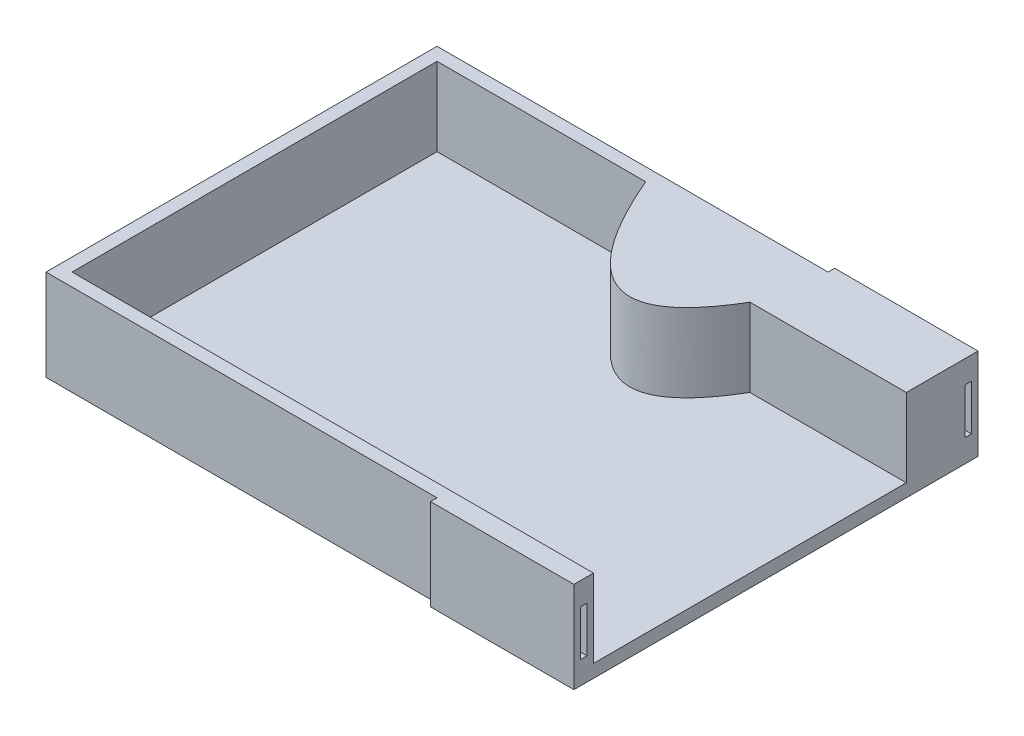
ISO-10303-21;
HEADER;
FILE_DESCRIPTION(('STEP AP214'),'2;1');
FILE_NAME('part.step','',(''),(''),'','','');
FILE_SCHEMA(('AUTOMOTIVE_DESIGN { 1 0 10303 214 1 1 1 1 }'));
ENDSEC;
DATA;
#1=APPLICATION_CONTEXT('core data for automotive mechanical design processes');
#2=APPLICATION_PROTOCOL_DEFINITION('international standard','automotive_design',2000,#1);
#3=PRODUCT_CONTEXT('',#1,'mechanical');
#4=PRODUCT('Part','Part','',(#3));
#5=PRODUCT_RELATED_PRODUCT_CATEGORY('part','',(#4));
#6=PRODUCT_DEFINITION_FORMATION('','',#4);
#7=PRODUCT_DEFINITION_CONTEXT('part definition',#1,'design');
#8=PRODUCT_DEFINITION('design','',#6,#7);
#9=PRODUCT_DEFINITION_SHAPE('','',#8);
#10=(LENGTH_UNIT() NAMED_UNIT(*) SI_UNIT(.MILLI.,.METRE.));
#11=(NAMED_UNIT(*) PLANE_ANGLE_UNIT() SI_UNIT($,.RADIAN.));
#12=(NAMED_UNIT(*) SI_UNIT($,.STERADIAN.) SOLID_ANGLE_UNIT());
#13=UNCERTAINTY_MEASURE_WITH_UNIT(LENGTH_MEASURE(1.E-05),#10,'distance_accuracy_value','');
#14=(GEOMETRIC_REPRESENTATION_CONTEXT(3) GLOBAL_UNCERTAINTY_ASSIGNED_CONTEXT((#13)) GLOBAL_UNIT_ASSIGNED_CONTEXT((#10,
#11,#12)) REPRESENTATION_CONTEXT('',''));
#15=CARTESIAN_POINT('',(0.,0.,0.));
#16=DIRECTION('',(0.,0.,1.));
#17=DIRECTION('',(1.,0.,0.));
#18=AXIS2_PLACEMENT_3D('',#15,#16,#17);
#19=CARTESIAN_POINT('',(0.,0.,75.));
#20=DIRECTION('',(0.,0.,-1.));
#21=DIRECTION('',(-1.,0.,0.));
#22=AXIS2_PLACEMENT_3D('',#19,#20,#21);
#23=PLANE('',#22);
#24=DIRECTION('',(0.,-1.,0.));
#25=VECTOR('',#24,1.);
#26=CARTESIAN_POINT('',(-55.,0.,75.));
#27=LINE('',#26,#25);
#28=CARTESIAN_POINT('',(-55.,35.,75.));
#29=VERTEX_POINT('',#28);
#30=CARTESIAN_POINT('',(-55.,0.,75.));
#31=VERTEX_POINT('',#30);
#32=EDGE_CURVE('E293',#29,#31,#27,.T.);
#33=ORIENTED_EDGE('',*,*,#32,.F.);
#34=DIRECTION('',(-1.,0.,0.));
#35=VECTOR('',#34,1.);
#36=CARTESIAN_POINT('',(-200.,35.,75.));
#37=LINE('',#36,#35);
#38=CARTESIAN_POINT('',(-205.,35.,75.));
#39=VERTEX_POINT('',#38);
#40=EDGE_CURVE('E386',#29,#39,#37,.T.);
#41=ORIENTED_EDGE('',*,*,#40,.T.);
#42=DIRECTION('',(0.,1.,0.));
#43=VECTOR('',#42,1.);
#44=CARTESIAN_POINT('',(-205.,0.,75.));
#45=LINE('',#44,#43);
#46=CARTESIAN_POINT('',(-205.,0.,75.));
#47=VERTEX_POINT('',#46);
#48=EDGE_CURVE('E375',#47,#39,#45,.T.);
#49=ORIENTED_EDGE('',*,*,#48,.F.);
#50=DIRECTION('',(1.,0.,0.));
#51=VECTOR('',#50,1.);
#52=CARTESIAN_POINT('',(-200.,0.,75.));
#53=LINE('',#52,#51);
#54=EDGE_CURVE('E384',#47,#31,#53,.T.);
#55=ORIENTED_EDGE('',*,*,#54,.T.);
#56=EDGE_LOOP('',(#33,#41,#49,#55));
#57=FACE_BOUND('',#56,.T.);
#58=ADVANCED_FACE('F39',(#57),#23,.F.);
#59=CARTESIAN_POINT('',(-120.,35.,-70.));
#60=CARTESIAN_POINT('',(-89.7131671713932,35.,0.733691908096874));
#61=CARTESIAN_POINT('',(-60.,35.,-50.));
#62=B_SPLINE_CURVE_WITH_KNOTS('',2,(#59,#60,#61),.UNSPECIFIED.,.F.,.F.,(3,3),(0.,1.),.UNSPECIFIED.);
#63=DIRECTION('',(0.,-1.,0.));
#64=VECTOR('',#63,1.);
#65=SURFACE_OF_LINEAR_EXTRUSION('',#62,#64);
#66=DIRECTION('',(0.,-1.,0.));
#67=VECTOR('',#66,1.);
#68=CARTESIAN_POINT('',(-120.,35.,-70.));
#69=LINE('',#68,#67);
#70=CARTESIAN_POINT('',(-120.,35.,-70.));
#71=VERTEX_POINT('',#70);
#72=CARTESIAN_POINT('',(-120.,5.,-70.));
#73=VERTEX_POINT('',#72);
#74=EDGE_CURVE('E433',#71,#73,#69,.T.);
#75=ORIENTED_EDGE('',*,*,#74,.T.);
#76=CARTESIAN_POINT('',(-120.,5.,-70.));
#77=CARTESIAN_POINT('',(-89.7131671713932,5.,0.733691908096874));
#78=CARTESIAN_POINT('',(-60.,5.,-50.));
#79=B_SPLINE_CURVE_WITH_KNOTS('',2,(#76,#77,#78),.UNSPECIFIED.,.F.,.F.,(3,3),(0.,1.),.UNSPECIFIED.);
#80=CARTESIAN_POINT('',(-60.,5.,-50.));
#81=VERTEX_POINT('',#80);
#82=EDGE_CURVE('E403',#73,#81,#79,.T.);
#83=ORIENTED_EDGE('',*,*,#82,.T.);
#84=DIRECTION('',(0.,-1.,0.));
#85=VECTOR('',#84,1.);
#86=CARTESIAN_POINT('',(-60.,35.,-50.));
#87=LINE('',#86,#85);
#88=CARTESIAN_POINT('',(-60.,35.,-50.));
#89=VERTEX_POINT('',#88);
#90=EDGE_CURVE('E442',#89,#81,#87,.T.);
#91=ORIENTED_EDGE('',*,*,#90,.F.);
#92=EDGE_CURVE('E418',#71,#89,#62,.T.);
#93=ORIENTED_EDGE('',*,*,#92,.F.);
#94=EDGE_LOOP('',(#75,#83,#91,#93));
#95=FACE_BOUND('',#94,.T.);
#96=ADVANCED_FACE('F41',(#95),#65,.F.);
#97=CARTESIAN_POINT('',(0.,35.,-49.9999999999999));
#98=DIRECTION('',(0.,0.,1.));
#99=DIRECTION('',(1.,0.,0.));
#100=AXIS2_PLACEMENT_3D('',#97,#98,#99);
#101=PLANE('',#100);
#102=DIRECTION('',(-1.,0.,0.));
#103=VECTOR('',#102,1.);
#104=CARTESIAN_POINT('',(0.,5.,-49.9999999999999));
#105=LINE('',#104,#103);
#106=CARTESIAN_POINT('',(0.,5.,-49.9999999999999));
#107=VERTEX_POINT('',#106);
#108=EDGE_CURVE('E417',#107,#81,#105,.T.);
#109=ORIENTED_EDGE('',*,*,#108,.F.);
#110=DIRECTION('',(0.,-1.,0.));
#111=VECTOR('',#110,1.);
#112=CARTESIAN_POINT('',(0.,35.,-49.9999999999999));
#113=LINE('',#112,#111);
#114=CARTESIAN_POINT('',(0.,35.,-49.9999999999999));
#115=VERTEX_POINT('',#114);
#116=EDGE_CURVE('E437',#115,#107,#113,.T.);
#117=ORIENTED_EDGE('',*,*,#116,.F.);
#118=DIRECTION('',(-1.,0.,0.));
#119=VECTOR('',#118,1.);
#120=CARTESIAN_POINT('',(0.,35.,-49.9999999999999));
#121=LINE('',#120,#119);
#122=EDGE_CURVE('E423',#115,#89,#121,.T.);
#123=ORIENTED_EDGE('',*,*,#122,.T.);
#124=ORIENTED_EDGE('',*,*,#90,.T.);
#125=EDGE_LOOP('',(#109,#117,#123,#124));
#126=FACE_BOUND('',#125,.T.);
#127=ADVANCED_FACE('F500',(#126),#101,.T.);
#128=CARTESIAN_POINT('',(0.,35.,0.));
#129=DIRECTION('',(1.,0.,0.));
#130=DIRECTION('',(0.,0.,-1.));
#131=AXIS2_PLACEMENT_3D('',#128,#129,#130);
#132=PLANE('',#131);
#133=DIRECTION('',(0.,0.,1.));
#134=VECTOR('',#133,1.);
#135=CARTESIAN_POINT('',(0.,0.,0.));
#136=LINE('',#135,#134);
#137=CARTESIAN_POINT('',(0.,0.,-77.5));
#138=VERTEX_POINT('',#137);
#139=CARTESIAN_POINT('',(0.,0.,77.5));
#140=VERTEX_POINT('',#139);
#141=EDGE_CURVE('E424',#138,#140,#136,.T.);
#142=ORIENTED_EDGE('',*,*,#141,.F.);
#143=DIRECTION('',(0.,-1.,0.));
#144=VECTOR('',#143,1.);
#145=CARTESIAN_POINT('',(0.,0.,-77.5));
#146=LINE('',#145,#144);
#147=CARTESIAN_POINT('',(0.,35.,-77.5));
#148=VERTEX_POINT('',#147);
#149=EDGE_CURVE('E269',#148,#138,#146,.T.);
#150=ORIENTED_EDGE('',*,*,#149,.F.);
#151=DIRECTION('',(0.,0.,1.));
#152=VECTOR('',#151,1.);
#153=CARTESIAN_POINT('',(0.,35.,0.));
#154=LINE('',#153,#152);
#155=EDGE_CURVE('E430',#148,#115,#154,.T.);
#156=ORIENTED_EDGE('',*,*,#155,.T.);
#157=ORIENTED_EDGE('',*,*,#116,.T.);
#158=DIRECTION('',(0.,0.,1.));
#159=VECTOR('',#158,1.);
#160=CARTESIAN_POINT('',(0.,5.,0.));
#161=LINE('',#160,#159);
#162=CARTESIAN_POINT('',(0.,5.,70.));
#163=VERTEX_POINT('',#162);
#164=EDGE_CURVE('E415',#107,#163,#161,.T.);
#165=ORIENTED_EDGE('',*,*,#164,.T.);
#166=DIRECTION('',(0.,1.,0.));
#167=VECTOR('',#166,1.);
#168=CARTESIAN_POINT('',(0.,0.,70.));
#169=LINE('',#168,#167);
#170=CARTESIAN_POINT('',(0.,35.,70.));
#171=VERTEX_POINT('',#170);
#172=EDGE_CURVE('E392',#163,#171,#169,.T.);
#173=ORIENTED_EDGE('',*,*,#172,.T.);
#174=DIRECTION('',(0.,0.,-1.));
#175=VECTOR('',#174,1.);
#176=CARTESIAN_POINT('',(0.,35.,75.));
#177=LINE('',#176,#175);
#178=CARTESIAN_POINT('',(0.,35.,77.5));
#179=VERTEX_POINT('',#178);
#180=EDGE_CURVE('E389',#179,#171,#177,.T.);
#181=ORIENTED_EDGE('',*,*,#180,.F.);
#182=DIRECTION('',(0.,1.,0.));
#183=VECTOR('',#182,1.);
#184=CARTESIAN_POINT('',(0.,0.,77.5));
#185=LINE('',#184,#183);
#186=EDGE_CURVE('E289',#140,#179,#185,.T.);
#187=ORIENTED_EDGE('',*,*,#186,.F.);
#188=EDGE_LOOP('',(#142,#150,#156,#157,#165,#173,#181,#187));
#189=FACE_BOUND('',#188,.T.);
#190=DIRECTION('',(0.,0.,1.));
#191=VECTOR('',#190,1.);
#192=CARTESIAN_POINT('',(0.,8.75,72.5));
#193=LINE('',#192,#191);
#194=CARTESIAN_POINT('',(0.,8.75,72.5));
#195=VERTEX_POINT('',#194);
#196=CARTESIAN_POINT('',(0.,8.75,75.));
#197=VERTEX_POINT('',#196);
#198=EDGE_CURVE('E360',#195,#197,#193,.T.);
#199=ORIENTED_EDGE('',*,*,#198,.T.);
#200=DIRECTION('',(0.,1.,0.));
#201=VECTOR('',#200,1.);
#202=CARTESIAN_POINT('',(0.,0.,75.));
#203=LINE('',#202,#201);
#204=CARTESIAN_POINT('',(0.,26.25,75.));
#205=VERTEX_POINT('',#204);
#206=EDGE_CURVE('E288',#197,#205,#203,.T.);
#207=ORIENTED_EDGE('',*,*,#206,.T.);
#208=DIRECTION('',(0.,0.,1.));
#209=VECTOR('',#208,1.);
#210=CARTESIAN_POINT('',(0.,26.25,72.5));
#211=LINE('',#210,#209);
#212=CARTESIAN_POINT('',(0.,26.25,72.5));
#213=VERTEX_POINT('',#212);
#214=EDGE_CURVE('E353',#213,#205,#211,.T.);
#215=ORIENTED_EDGE('',*,*,#214,.F.);
#216=DIRECTION('',(0.,1.,0.));
#217=VECTOR('',#216,1.);
#218=CARTESIAN_POINT('',(0.,26.25,72.5));
#219=LINE('',#218,#217);
#220=EDGE_CURVE('E340',#195,#213,#219,.T.);
#221=ORIENTED_EDGE('',*,*,#220,.F.);
#222=EDGE_LOOP('',(#199,#207,#215,#221));
#223=FACE_BOUND('',#222,.T.);
#224=DIRECTION('',(0.,0.,-1.));
#225=VECTOR('',#224,1.);
#226=CARTESIAN_POINT('',(0.,26.25,-72.5));
#227=LINE('',#226,#225);
#228=CARTESIAN_POINT('',(0.,26.25,-72.5));
#229=VERTEX_POINT('',#228);
#230=CARTESIAN_POINT('',(0.,26.25,-75.));
#231=VERTEX_POINT('',#230);
#232=EDGE_CURVE('E331',#229,#231,#227,.T.);
#233=ORIENTED_EDGE('',*,*,#232,.T.);
#234=DIRECTION('',(0.,-1.,0.));
#235=VECTOR('',#234,1.);
#236=CARTESIAN_POINT('',(0.,0.,-75.));
#237=LINE('',#236,#235);
#238=CARTESIAN_POINT('',(0.,8.75,-75.));
#239=VERTEX_POINT('',#238);
#240=EDGE_CURVE('E263',#231,#239,#237,.T.);
#241=ORIENTED_EDGE('',*,*,#240,.T.);
#242=DIRECTION('',(0.,0.,-1.));
#243=VECTOR('',#242,1.);
#244=CARTESIAN_POINT('',(0.,8.75,-72.5));
#245=LINE('',#244,#243);
#246=CARTESIAN_POINT('',(0.,8.75,-72.5));
#247=VERTEX_POINT('',#246);
#248=EDGE_CURVE('E324',#247,#239,#245,.T.);
#249=ORIENTED_EDGE('',*,*,#248,.F.);
#250=DIRECTION('',(0.,-1.,0.));
#251=VECTOR('',#250,1.);
#252=CARTESIAN_POINT('',(0.,26.25,-72.5));
#253=LINE('',#252,#251);
#254=EDGE_CURVE('E311',#229,#247,#253,.T.);
#255=ORIENTED_EDGE('',*,*,#254,.F.);
#256=EDGE_LOOP('',(#233,#241,#249,#255));
#257=FACE_BOUND('',#256,.T.);
#258=ADVANCED_FACE('F525',(#189,#223,#257),#132,.T.);
#259=CARTESIAN_POINT('',(0.,35.,0.));
#260=DIRECTION('',(0.,1.,0.));
#261=DIRECTION('',(0.,0.,1.));
#262=AXIS2_PLACEMENT_3D('',#259,#260,#261);
#263=PLANE('',#262);
#264=ORIENTED_EDGE('',*,*,#92,.T.);
#265=ORIENTED_EDGE('',*,*,#122,.F.);
#266=ORIENTED_EDGE('',*,*,#155,.F.);
#267=DIRECTION('',(1.,0.,0.));
#268=VECTOR('',#267,1.);
#269=CARTESIAN_POINT('',(0.,35.,-77.5));
#270=LINE('',#269,#268);
#271=CARTESIAN_POINT('',(-55.0000000000001,35.,-77.5));
#272=VERTEX_POINT('',#271);
#273=EDGE_CURVE('E276',#272,#148,#270,.T.);
#274=ORIENTED_EDGE('',*,*,#273,.F.);
#275=DIRECTION('',(0.,0.,1.));
#276=VECTOR('',#275,1.);
#277=CARTESIAN_POINT('',(-55.0000000000001,35.,-77.5));
#278=LINE('',#277,#276);
#279=CARTESIAN_POINT('',(-55.0000000000001,35.,-75.));
#280=VERTEX_POINT('',#279);
#281=EDGE_CURVE('E279',#272,#280,#278,.T.);
#282=ORIENTED_EDGE('',*,*,#281,.T.);
#283=DIRECTION('',(1.,0.,0.));
#284=VECTOR('',#283,1.);
#285=CARTESIAN_POINT('',(-200.,35.,-75.));
#286=LINE('',#285,#284);
#287=CARTESIAN_POINT('',(-205.,35.,-75.));
#288=VERTEX_POINT('',#287);
#289=EDGE_CURVE('E398',#288,#280,#286,.T.);
#290=ORIENTED_EDGE('',*,*,#289,.F.);
#291=DIRECTION('',(0.,0.,-1.));
#292=VECTOR('',#291,1.);
#293=CARTESIAN_POINT('',(-205.,35.,-75.));
#294=LINE('',#293,#292);
#295=EDGE_CURVE('E378',#39,#288,#294,.T.);
#296=ORIENTED_EDGE('',*,*,#295,.F.);
#297=ORIENTED_EDGE('',*,*,#40,.F.);
#298=DIRECTION('',(0.,0.,-1.));
#299=VECTOR('',#298,1.);
#300=CARTESIAN_POINT('',(-55.,35.,77.5));
#301=LINE('',#300,#299);
#302=CARTESIAN_POINT('',(-55.,35.,77.5));
#303=VERTEX_POINT('',#302);
#304=EDGE_CURVE('E307',#303,#29,#301,.T.);
#305=ORIENTED_EDGE('',*,*,#304,.F.);
#306=DIRECTION('',(-1.,0.,0.));
#307=VECTOR('',#306,1.);
#308=CARTESIAN_POINT('',(0.,35.,77.5));
#309=LINE('',#308,#307);
#310=EDGE_CURVE('E292',#179,#303,#309,.T.);
#311=ORIENTED_EDGE('',*,*,#310,.F.);
#312=ORIENTED_EDGE('',*,*,#180,.T.);
#313=DIRECTION('',(-1.,0.,0.));
#314=VECTOR('',#313,1.);
#315=CARTESIAN_POINT('',(-200.,35.,70.));
#316=LINE('',#315,#314);
#317=CARTESIAN_POINT('',(-200.,35.,70.));
#318=VERTEX_POINT('',#317);
#319=EDGE_CURVE('E387',#171,#318,#316,.T.);
#320=ORIENTED_EDGE('',*,*,#319,.T.);
#321=DIRECTION('',(0.,0.,-1.));
#322=VECTOR('',#321,1.);
#323=CARTESIAN_POINT('',(-200.,35.,-75.));
#324=LINE('',#323,#322);
#325=CARTESIAN_POINT('',(-200.,35.,-70.));
#326=VERTEX_POINT('',#325);
#327=EDGE_CURVE('E363',#318,#326,#324,.T.);
#328=ORIENTED_EDGE('',*,*,#327,.T.);
#329=DIRECTION('',(1.,0.,0.));
#330=VECTOR('',#329,1.);
#331=CARTESIAN_POINT('',(-200.,35.,-70.));
#332=LINE('',#331,#330);
#333=EDGE_CURVE('E401',#326,#71,#332,.T.);
#334=ORIENTED_EDGE('',*,*,#333,.T.);
#335=EDGE_LOOP('',(#264,#265,#266,#274,#282,#290,#296,#297,#305,#311,#312,#320,#328,#334));
#336=FACE_BOUND('',#335,.T.);
#337=ADVANCED_FACE('F522',(#336),#263,.T.);
#338=CARTESIAN_POINT('',(0.,0.,0.));
#339=DIRECTION('',(0.,1.,0.));
#340=DIRECTION('',(0.,0.,1.));
#341=AXIS2_PLACEMENT_3D('',#338,#339,#340);
#342=PLANE('',#341);
#343=DIRECTION('',(-1.,0.,0.));
#344=VECTOR('',#343,1.);
#345=CARTESIAN_POINT('',(0.,0.,-70.));
#346=LINE('',#345,#344);
#347=CARTESIAN_POINT('',(-5.00000000000006,0.,-70.));
#348=VERTEX_POINT('',#347);
#349=CARTESIAN_POINT('',(-114.377865486868,0.,-70.));
#350=VERTEX_POINT('',#349);
#351=EDGE_CURVE('E48',#348,#350,#346,.T.);
#352=ORIENTED_EDGE('',*,*,#351,.T.);
#353=DIRECTION('',(0.457242734720878,0.,0.889341937358727));
#354=VECTOR('',#353,1.);
#355=CARTESIAN_POINT('',(-61.9996203308124,0.,31.8762387793279));
#356=LINE('',#355,#354);
#357=CARTESIAN_POINT('',(-103.799594749147,0.,-49.4251519435657));
#358=VERTEX_POINT('',#357);
#359=EDGE_CURVE('E11',#350,#358,#356,.T.);
#360=ORIENTED_EDGE('',*,*,#359,.T.);
#361=CARTESIAN_POINT('',(-103.799594749147,0.,-49.4251519435657));
#362=CARTESIAN_POINT('',(-99.2051605131029,0.,-42.585467380585));
#363=CARTESIAN_POINT('',(-92.286089612762,0.,-36.3651585992353));
#364=CARTESIAN_POINT('',(-88.081814147023,0.,-34.294431753635));
#365=CARTESIAN_POINT('',(-85.4337162972055,0.,-33.7920961129075));
#366=CARTESIAN_POINT('',(-83.3961782752048,0.,-33.8237575613017));
#367=CARTESIAN_POINT('',(-81.3048633703737,0.,-34.2924033606753));
#368=CARTESIAN_POINT('',(-78.5001043520789,0.,-35.5110922493851));
#369=CARTESIAN_POINT('',(-74.1123007701366,0.,-38.8128478568057));
#370=CARTESIAN_POINT('',(-69.3283756488378,0.,-44.5174770783803));
#371=CARTESIAN_POINT('',(-66.3438674231853,0.,-49.0844572629766));
#372=CARTESIAN_POINT('',(-65.1040192502342,0.,-51.155937562833));
#373=CARTESIAN_POINT('',(-64.4011869805069,0.,-52.3723279960872));
#374=CARTESIAN_POINT('',(-63.466265427309,0.,-54.0216022142181));
#375=CARTESIAN_POINT('',(-62.9095659229218,0.,-54.9999999999999));
#376=B_SPLINE_CURVE_WITH_KNOTS('',2,(#361,#362,#363,#364,#365,#366,#367,#368,#369,#370,#371,
#372,#373,#374,#375),.UNSPECIFIED.,.F.,.F.,(3,1,1,1,1,1,1,1,1,1,1,1,1,3),(-0.0310241649131791,
0.161695719545825,0.290175642518495,0.386535584747997,0.450775546234332,0.515015507720667,
0.579255469207002,0.675615411436504,0.804095334409174,0.900455276638676,0.940605252567635,
0.956665242939219,0.972725233310803,0.996815218868178),.UNSPECIFIED.);
#377=CARTESIAN_POINT('',(-62.9095659229218,0.,-54.9999999999999));
#378=VERTEX_POINT('',#377);
#379=EDGE_CURVE('E222',#358,#378,#376,.T.);
#380=ORIENTED_EDGE('',*,*,#379,.T.);
#381=DIRECTION('',(1.,0.,0.));
#382=VECTOR('',#381,1.);
#383=CARTESIAN_POINT('',(-3.03152014647316E-13,0.,-54.9999999999999));
#384=LINE('',#383,#382);
#385=CARTESIAN_POINT('',(-5.00000000000006,0.,-54.9999999999999));
#386=VERTEX_POINT('',#385);
#387=EDGE_CURVE('E464',#378,#386,#384,.T.);
#388=ORIENTED_EDGE('',*,*,#387,.T.);
#389=DIRECTION('',(0.,0.,-1.));
#390=VECTOR('',#389,1.);
#391=CARTESIAN_POINT('',(-5.00000000000006,0.,0.));
#392=LINE('',#391,#390);
#393=EDGE_CURVE('E470',#386,#348,#392,.T.);
#394=ORIENTED_EDGE('',*,*,#393,.T.);
#395=EDGE_LOOP('',(#352,#360,#380,#388,#394));
#396=FACE_BOUND('',#395,.T.);
#397=ORIENTED_EDGE('',*,*,#54,.F.);
#398=DIRECTION('',(0.,0.,1.));
#399=VECTOR('',#398,1.);
#400=CARTESIAN_POINT('',(-205.,0.,-75.));
#401=LINE('',#400,#399);
#402=CARTESIAN_POINT('',(-205.,0.,-75.));
#403=VERTEX_POINT('',#402);
#404=EDGE_CURVE('E372',#403,#47,#401,.T.);
#405=ORIENTED_EDGE('',*,*,#404,.F.);
#406=DIRECTION('',(-1.,0.,0.));
#407=VECTOR('',#406,1.);
#408=CARTESIAN_POINT('',(-200.,0.,-75.));
#409=LINE('',#408,#407);
#410=CARTESIAN_POINT('',(-55.,0.,-75.));
#411=VERTEX_POINT('',#410);
#412=EDGE_CURVE('E400',#411,#403,#409,.T.);
#413=ORIENTED_EDGE('',*,*,#412,.F.);
#414=DIRECTION('',(0.,0.,1.));
#415=VECTOR('',#414,1.);
#416=CARTESIAN_POINT('',(-55.0000000000001,0.,-77.5));
#417=LINE('',#416,#415);
#418=CARTESIAN_POINT('',(-55.0000000000001,0.,-77.5));
#419=VERTEX_POINT('',#418);
#420=EDGE_CURVE('E285',#419,#411,#417,.T.);
#421=ORIENTED_EDGE('',*,*,#420,.F.);
#422=DIRECTION('',(-1.,0.,0.));
#423=VECTOR('',#422,1.);
#424=CARTESIAN_POINT('',(0.,0.,-77.5));
#425=LINE('',#424,#423);
#426=EDGE_CURVE('E272',#138,#419,#425,.T.);
#427=ORIENTED_EDGE('',*,*,#426,.F.);
#428=ORIENTED_EDGE('',*,*,#141,.T.);
#429=DIRECTION('',(1.,0.,0.));
#430=VECTOR('',#429,1.);
#431=CARTESIAN_POINT('',(0.,0.,77.5));
#432=LINE('',#431,#430);
#433=CARTESIAN_POINT('',(-55.,0.,77.5));
#434=VERTEX_POINT('',#433);
#435=EDGE_CURVE('E297',#434,#140,#432,.T.);
#436=ORIENTED_EDGE('',*,*,#435,.F.);
#437=DIRECTION('',(0.,0.,-1.));
#438=VECTOR('',#437,1.);
#439=CARTESIAN_POINT('',(-55.,0.,77.5));
#440=LINE('',#439,#438);
#441=EDGE_CURVE('E300',#434,#31,#440,.T.);
#442=ORIENTED_EDGE('',*,*,#441,.T.);
#443=EDGE_LOOP('',(#397,#405,#413,#421,#427,#428,#436,#442));
#444=FACE_BOUND('',#443,.T.);
#445=ADVANCED_FACE('F474',(#396,#444),#342,.F.);
#446=CARTESIAN_POINT('',(0.,5.,0.));
#447=DIRECTION('',(0.,1.,0.));
#448=DIRECTION('',(0.,0.,1.));
#449=AXIS2_PLACEMENT_3D('',#446,#447,#448);
#450=PLANE('',#449);
#451=ORIENTED_EDGE('',*,*,#82,.F.);
#452=DIRECTION('',(1.,0.,0.));
#453=VECTOR('',#452,1.);
#454=CARTESIAN_POINT('',(0.,5.,-70.));
#455=LINE('',#454,#453);
#456=CARTESIAN_POINT('',(-200.,5.,-70.));
#457=VERTEX_POINT('',#456);
#458=EDGE_CURVE('E412',#457,#73,#455,.T.);
#459=ORIENTED_EDGE('',*,*,#458,.F.);
#460=DIRECTION('',(0.,0.,1.));
#461=VECTOR('',#460,1.);
#462=CARTESIAN_POINT('',(-200.,5.,0.));
#463=LINE('',#462,#461);
#464=CARTESIAN_POINT('',(-200.,5.,70.));
#465=VERTEX_POINT('',#464);
#466=EDGE_CURVE('E408',#457,#465,#463,.T.);
#467=ORIENTED_EDGE('',*,*,#466,.T.);
#468=DIRECTION('',(1.,0.,0.));
#469=VECTOR('',#468,1.);
#470=CARTESIAN_POINT('',(0.,5.,70.));
#471=LINE('',#470,#469);
#472=EDGE_CURVE('E411',#465,#163,#471,.T.);
#473=ORIENTED_EDGE('',*,*,#472,.T.);
#474=ORIENTED_EDGE('',*,*,#164,.F.);
#475=ORIENTED_EDGE('',*,*,#108,.T.);
#476=EDGE_LOOP('',(#451,#459,#467,#473,#474,#475));
#477=FACE_BOUND('',#476,.T.);
#478=ADVANCED_FACE('F517',(#477),#450,.T.);
#479=CARTESIAN_POINT('',(0.,0.,-70.));
#480=DIRECTION('',(0.,0.,-1.));
#481=DIRECTION('',(-1.,0.,0.));
#482=AXIS2_PLACEMENT_3D('',#479,#480,#481);
#483=PLANE('',#482);
#484=ORIENTED_EDGE('',*,*,#458,.T.);
#485=ORIENTED_EDGE('',*,*,#74,.F.);
#486=ORIENTED_EDGE('',*,*,#333,.F.);
#487=DIRECTION('',(0.,1.,0.));
#488=VECTOR('',#487,1.);
#489=CARTESIAN_POINT('',(-200.,0.,-70.));
#490=LINE('',#489,#488);
#491=EDGE_CURVE('E397',#457,#326,#490,.T.);
#492=ORIENTED_EDGE('',*,*,#491,.F.);
#493=EDGE_LOOP('',(#484,#485,#486,#492));
#494=FACE_BOUND('',#493,.T.);
#495=ADVANCED_FACE('F514',(#494),#483,.F.);
#496=CARTESIAN_POINT('',(0.,0.,-75.));
#497=DIRECTION('',(0.,0.,-1.));
#498=DIRECTION('',(-1.,0.,0.));
#499=AXIS2_PLACEMENT_3D('',#496,#497,#498);
#500=PLANE('',#499);
#501=DIRECTION('',(0.,1.,0.));
#502=VECTOR('',#501,1.);
#503=CARTESIAN_POINT('',(-55.0000000000001,0.,-75.));
#504=LINE('',#503,#502);
#505=EDGE_CURVE('E63',#411,#280,#504,.T.);
#506=ORIENTED_EDGE('',*,*,#505,.F.);
#507=ORIENTED_EDGE('',*,*,#412,.T.);
#508=DIRECTION('',(0.,-1.,0.));
#509=VECTOR('',#508,1.);
#510=CARTESIAN_POINT('',(-205.,0.,-75.));
#511=LINE('',#510,#509);
#512=EDGE_CURVE('E369',#288,#403,#511,.T.);
#513=ORIENTED_EDGE('',*,*,#512,.F.);
#514=ORIENTED_EDGE('',*,*,#289,.T.);
#515=EDGE_LOOP('',(#506,#507,#513,#514));
#516=FACE_BOUND('',#515,.T.);
#517=ADVANCED_FACE('F510',(#516),#500,.T.);
#518=CARTESIAN_POINT('',(0.,0.,70.));
#519=DIRECTION('',(0.,0.,-1.));
#520=DIRECTION('',(-1.,0.,0.));
#521=AXIS2_PLACEMENT_3D('',#518,#519,#520);
#522=PLANE('',#521);
#523=ORIENTED_EDGE('',*,*,#472,.F.);
#524=DIRECTION('',(0.,-1.,0.));
#525=VECTOR('',#524,1.);
#526=CARTESIAN_POINT('',(-200.,0.,70.));
#527=LINE('',#526,#525);
#528=EDGE_CURVE('E381',#318,#465,#527,.T.);
#529=ORIENTED_EDGE('',*,*,#528,.F.);
#530=ORIENTED_EDGE('',*,*,#319,.F.);
#531=ORIENTED_EDGE('',*,*,#172,.F.);
#532=EDGE_LOOP('',(#523,#529,#530,#531));
#533=FACE_BOUND('',#532,.T.);
#534=ADVANCED_FACE('F506',(#533),#522,.T.);
#535=CARTESIAN_POINT('',(-205.,0.,0.));
#536=DIRECTION('',(1.,0.,0.));
#537=DIRECTION('',(0.,0.,-1.));
#538=AXIS2_PLACEMENT_3D('',#535,#536,#537);
#539=PLANE('',#538);
#540=ORIENTED_EDGE('',*,*,#512,.T.);
#541=ORIENTED_EDGE('',*,*,#404,.T.);
#542=ORIENTED_EDGE('',*,*,#48,.T.);
#543=ORIENTED_EDGE('',*,*,#295,.T.);
#544=EDGE_LOOP('',(#540,#541,#542,#543));
#545=FACE_BOUND('',#544,.T.);
#546=ADVANCED_FACE('F509',(#545),#539,.F.);
#547=CARTESIAN_POINT('',(-200.,0.,0.));
#548=DIRECTION('',(1.,0.,0.));
#549=DIRECTION('',(0.,0.,-1.));
#550=AXIS2_PLACEMENT_3D('',#547,#548,#549);
#551=PLANE('',#550);
#552=ORIENTED_EDGE('',*,*,#327,.F.);
#553=ORIENTED_EDGE('',*,*,#528,.T.);
#554=ORIENTED_EDGE('',*,*,#466,.F.);
#555=ORIENTED_EDGE('',*,*,#491,.T.);
#556=EDGE_LOOP('',(#552,#553,#554,#555));
#557=FACE_BOUND('',#556,.T.);
#558=ADVANCED_FACE('F504',(#557),#551,.T.);
#559=CARTESIAN_POINT('',(0.,8.75,72.5));
#560=DIRECTION('',(0.,-1.,0.));
#561=DIRECTION('',(1.,0.,0.));
#562=AXIS2_PLACEMENT_3D('',#559,#560,#561);
#563=PLANE('',#562);
#564=DIRECTION('',(1.,0.,0.));
#565=VECTOR('',#564,1.);
#566=CARTESIAN_POINT('',(0.,8.75,75.));
#567=LINE('',#566,#565);
#568=CARTESIAN_POINT('',(-50.,8.74999999999999,75.));
#569=VERTEX_POINT('',#568);
#570=EDGE_CURVE('E344',#569,#197,#567,.T.);
#571=ORIENTED_EDGE('',*,*,#570,.T.);
#572=ORIENTED_EDGE('',*,*,#198,.F.);
#573=DIRECTION('',(1.,0.,0.));
#574=VECTOR('',#573,1.);
#575=CARTESIAN_POINT('',(0.,8.75,72.5));
#576=LINE('',#575,#574);
#577=CARTESIAN_POINT('',(-50.,8.74999999999999,72.5));
#578=VERTEX_POINT('',#577);
#579=EDGE_CURVE('E350',#578,#195,#576,.T.);
#580=ORIENTED_EDGE('',*,*,#579,.F.);
#581=DIRECTION('',(0.,0.,1.));
#582=VECTOR('',#581,1.);
#583=CARTESIAN_POINT('',(-50.,8.74999999999999,72.5));
#584=LINE('',#583,#582);
#585=EDGE_CURVE('E364',#578,#569,#584,.T.);
#586=ORIENTED_EDGE('',*,*,#585,.T.);
#587=EDGE_LOOP('',(#571,#572,#580,#586));
#588=FACE_BOUND('',#587,.T.);
#589=ADVANCED_FACE('F575',(#588),#563,.F.);
#590=CARTESIAN_POINT('',(-50.,26.25,72.5));
#591=DIRECTION('',(-1.,0.,0.));
#592=DIRECTION('',(0.,0.,1.));
#593=AXIS2_PLACEMENT_3D('',#590,#591,#592);
#594=PLANE('',#593);
#595=DIRECTION('',(0.,-1.,0.));
#596=VECTOR('',#595,1.);
#597=CARTESIAN_POINT('',(-50.,26.25,75.));
#598=LINE('',#597,#596);
#599=CARTESIAN_POINT('',(-50.,26.25,75.));
#600=VERTEX_POINT('',#599);
#601=EDGE_CURVE('E356',#600,#569,#598,.T.);
#602=ORIENTED_EDGE('',*,*,#601,.T.);
#603=ORIENTED_EDGE('',*,*,#585,.F.);
#604=DIRECTION('',(0.,-1.,0.));
#605=VECTOR('',#604,1.);
#606=CARTESIAN_POINT('',(-50.,26.25,72.5));
#607=LINE('',#606,#605);
#608=CARTESIAN_POINT('',(-50.,26.25,72.5));
#609=VERTEX_POINT('',#608);
#610=EDGE_CURVE('E347',#609,#578,#607,.T.);
#611=ORIENTED_EDGE('',*,*,#610,.F.);
#612=DIRECTION('',(0.,0.,1.));
#613=VECTOR('',#612,1.);
#614=CARTESIAN_POINT('',(-50.,26.25,72.5));
#615=LINE('',#614,#613);
#616=EDGE_CURVE('E366',#609,#600,#615,.T.);
#617=ORIENTED_EDGE('',*,*,#616,.T.);
#618=EDGE_LOOP('',(#602,#603,#611,#617));
#619=FACE_BOUND('',#618,.T.);
#620=ADVANCED_FACE('F581',(#619),#594,.F.);
#621=CARTESIAN_POINT('',(0.,26.25,72.5));
#622=DIRECTION('',(0.,1.,0.));
#623=DIRECTION('',(-1.,0.,0.));
#624=AXIS2_PLACEMENT_3D('',#621,#622,#623);
#625=PLANE('',#624);
#626=DIRECTION('',(-1.,0.,0.));
#627=VECTOR('',#626,1.);
#628=CARTESIAN_POINT('',(0.,26.25,75.));
#629=LINE('',#628,#627);
#630=EDGE_CURVE('E334',#205,#600,#629,.T.);
#631=ORIENTED_EDGE('',*,*,#630,.T.);
#632=ORIENTED_EDGE('',*,*,#616,.F.);
#633=DIRECTION('',(-1.,0.,0.));
#634=VECTOR('',#633,1.);
#635=CARTESIAN_POINT('',(0.,26.25,72.5));
#636=LINE('',#635,#634);
#637=EDGE_CURVE('E343',#213,#609,#636,.T.);
#638=ORIENTED_EDGE('',*,*,#637,.F.);
#639=ORIENTED_EDGE('',*,*,#214,.T.);
#640=EDGE_LOOP('',(#631,#632,#638,#639));
#641=FACE_BOUND('',#640,.T.);
#642=ADVANCED_FACE('F587',(#641),#625,.F.);
#643=CARTESIAN_POINT('',(0.,0.,72.5));
#644=DIRECTION('',(0.,0.,-1.));
#645=DIRECTION('',(-1.,0.,0.));
#646=AXIS2_PLACEMENT_3D('',#643,#644,#645);
#647=PLANE('',#646);
#648=ORIENTED_EDGE('',*,*,#220,.T.);
#649=ORIENTED_EDGE('',*,*,#637,.T.);
#650=ORIENTED_EDGE('',*,*,#610,.T.);
#651=ORIENTED_EDGE('',*,*,#579,.T.);
#652=EDGE_LOOP('',(#648,#649,#650,#651));
#653=FACE_BOUND('',#652,.T.);
#654=ADVANCED_FACE('F590',(#653),#647,.F.);
#655=CARTESIAN_POINT('',(0.,26.25,-72.5));
#656=DIRECTION('',(0.,1.,0.));
#657=DIRECTION('',(0.,0.,1.));
#658=AXIS2_PLACEMENT_3D('',#655,#656,#657);
#659=PLANE('',#658);
#660=DIRECTION('',(1.,0.,0.));
#661=VECTOR('',#660,1.);
#662=CARTESIAN_POINT('',(0.,26.25,-75.));
#663=LINE('',#662,#661);
#664=CARTESIAN_POINT('',(-50.,26.25,-75.));
#665=VERTEX_POINT('',#664);
#666=EDGE_CURVE('E315',#665,#231,#663,.T.);
#667=ORIENTED_EDGE('',*,*,#666,.T.);
#668=ORIENTED_EDGE('',*,*,#232,.F.);
#669=DIRECTION('',(1.,0.,0.));
#670=VECTOR('',#669,1.);
#671=CARTESIAN_POINT('',(0.,26.25,-72.5));
#672=LINE('',#671,#670);
#673=CARTESIAN_POINT('',(-50.,26.25,-72.5));
#674=VERTEX_POINT('',#673);
#675=EDGE_CURVE('E321',#674,#229,#672,.T.);
#676=ORIENTED_EDGE('',*,*,#675,.F.);
#677=DIRECTION('',(0.,0.,-1.));
#678=VECTOR('',#677,1.);
#679=CARTESIAN_POINT('',(-50.,26.25,-72.5));
#680=LINE('',#679,#678);
#681=EDGE_CURVE('E335',#674,#665,#680,.T.);
#682=ORIENTED_EDGE('',*,*,#681,.T.);
#683=EDGE_LOOP('',(#667,#668,#676,#682));
#684=FACE_BOUND('',#683,.T.);
#685=ADVANCED_FACE('F597',(#684),#659,.F.);
#686=CARTESIAN_POINT('',(-50.,26.25,-72.5));
#687=DIRECTION('',(-1.,0.,0.));
#688=DIRECTION('',(0.,0.,1.));
#689=AXIS2_PLACEMENT_3D('',#686,#687,#688);
#690=PLANE('',#689);
#691=DIRECTION('',(0.,1.,0.));
#692=VECTOR('',#691,1.);
#693=CARTESIAN_POINT('',(-50.,26.25,-75.));
#694=LINE('',#693,#692);
#695=CARTESIAN_POINT('',(-50.,8.75,-75.));
#696=VERTEX_POINT('',#695);
#697=EDGE_CURVE('E327',#696,#665,#694,.T.);
#698=ORIENTED_EDGE('',*,*,#697,.T.);
#699=ORIENTED_EDGE('',*,*,#681,.F.);
#700=DIRECTION('',(0.,1.,0.));
#701=VECTOR('',#700,1.);
#702=CARTESIAN_POINT('',(-50.,26.25,-72.5));
#703=LINE('',#702,#701);
#704=CARTESIAN_POINT('',(-50.,8.75,-72.5));
#705=VERTEX_POINT('',#704);
#706=EDGE_CURVE('E318',#705,#674,#703,.T.);
#707=ORIENTED_EDGE('',*,*,#706,.F.);
#708=DIRECTION('',(0.,0.,-1.));
#709=VECTOR('',#708,1.);
#710=CARTESIAN_POINT('',(-50.,8.75,-72.5));
#711=LINE('',#710,#709);
#712=EDGE_CURVE('E337',#705,#696,#711,.T.);
#713=ORIENTED_EDGE('',*,*,#712,.T.);
#714=EDGE_LOOP('',(#698,#699,#707,#713));
#715=FACE_BOUND('',#714,.T.);
#716=ADVANCED_FACE('F603',(#715),#690,.F.);
#717=CARTESIAN_POINT('',(0.,8.75,-72.5));
#718=DIRECTION('',(0.,-1.,0.));
#719=DIRECTION('',(0.,0.,-1.));
#720=AXIS2_PLACEMENT_3D('',#717,#718,#719);
#721=PLANE('',#720);
#722=DIRECTION('',(-1.,0.,0.));
#723=VECTOR('',#722,1.);
#724=CARTESIAN_POINT('',(0.,8.75,-75.));
#725=LINE('',#724,#723);
#726=EDGE_CURVE('E310',#239,#696,#725,.T.);
#727=ORIENTED_EDGE('',*,*,#726,.T.);
#728=ORIENTED_EDGE('',*,*,#712,.F.);
#729=DIRECTION('',(-1.,0.,0.));
#730=VECTOR('',#729,1.);
#731=CARTESIAN_POINT('',(0.,8.75,-72.5));
#732=LINE('',#731,#730);
#733=EDGE_CURVE('E314',#247,#705,#732,.T.);
#734=ORIENTED_EDGE('',*,*,#733,.F.);
#735=ORIENTED_EDGE('',*,*,#248,.T.);
#736=EDGE_LOOP('',(#727,#728,#734,#735));
#737=FACE_BOUND('',#736,.T.);
#738=ADVANCED_FACE('F599',(#737),#721,.F.);
#739=CARTESIAN_POINT('',(0.,0.,-72.5));
#740=DIRECTION('',(0.,0.,-1.));
#741=DIRECTION('',(-1.,0.,0.));
#742=AXIS2_PLACEMENT_3D('',#739,#740,#741);
#743=PLANE('',#742);
#744=ORIENTED_EDGE('',*,*,#254,.T.);
#745=ORIENTED_EDGE('',*,*,#733,.T.);
#746=ORIENTED_EDGE('',*,*,#706,.T.);
#747=ORIENTED_EDGE('',*,*,#675,.T.);
#748=EDGE_LOOP('',(#744,#745,#746,#747));
#749=FACE_BOUND('',#748,.T.);
#750=ADVANCED_FACE('F602',(#749),#743,.T.);
#751=CARTESIAN_POINT('',(-55.,0.,77.5));
#752=DIRECTION('',(1.,0.,0.));
#753=DIRECTION('',(0.,0.,-1.));
#754=AXIS2_PLACEMENT_3D('',#751,#752,#753);
#755=PLANE('',#754);
#756=ORIENTED_EDGE('',*,*,#32,.T.);
#757=ORIENTED_EDGE('',*,*,#441,.F.);
#758=DIRECTION('',(0.,-1.,0.));
#759=VECTOR('',#758,1.);
#760=CARTESIAN_POINT('',(-55.,0.,77.5));
#761=LINE('',#760,#759);
#762=EDGE_CURVE('E295',#303,#434,#761,.T.);
#763=ORIENTED_EDGE('',*,*,#762,.F.);
#764=ORIENTED_EDGE('',*,*,#304,.T.);
#765=EDGE_LOOP('',(#756,#757,#763,#764));
#766=FACE_BOUND('',#765,.T.);
#767=ADVANCED_FACE('F561',(#766),#755,.F.);
#768=CARTESIAN_POINT('',(0.,0.,77.5));
#769=DIRECTION('',(0.,0.,1.));
#770=DIRECTION('',(1.,0.,0.));
#771=AXIS2_PLACEMENT_3D('',#768,#769,#770);
#772=PLANE('',#771);
#773=ORIENTED_EDGE('',*,*,#186,.T.);
#774=ORIENTED_EDGE('',*,*,#310,.T.);
#775=ORIENTED_EDGE('',*,*,#762,.T.);
#776=ORIENTED_EDGE('',*,*,#435,.T.);
#777=EDGE_LOOP('',(#773,#774,#775,#776));
#778=FACE_BOUND('',#777,.T.);
#779=ADVANCED_FACE('F565',(#778),#772,.T.);
#780=CARTESIAN_POINT('',(0.,0.,75.));
#781=DIRECTION('',(0.,0.,1.));
#782=DIRECTION('',(1.,0.,0.));
#783=AXIS2_PLACEMENT_3D('',#780,#781,#782);
#784=PLANE('',#783);
#785=ORIENTED_EDGE('',*,*,#570,.F.);
#786=ORIENTED_EDGE('',*,*,#601,.F.);
#787=ORIENTED_EDGE('',*,*,#630,.F.);
#788=ORIENTED_EDGE('',*,*,#206,.F.);
#789=EDGE_LOOP('',(#785,#786,#787,#788));
#790=FACE_BOUND('',#789,.T.);
#791=ADVANCED_FACE('F616',(#790),#784,.F.);
#792=CARTESIAN_POINT('',(0.,0.,-75.));
#793=DIRECTION('',(0.,0.,1.));
#794=DIRECTION('',(1.,0.,0.));
#795=AXIS2_PLACEMENT_3D('',#792,#793,#794);
#796=PLANE('',#795);
#797=ORIENTED_EDGE('',*,*,#666,.F.);
#798=ORIENTED_EDGE('',*,*,#697,.F.);
#799=ORIENTED_EDGE('',*,*,#726,.F.);
#800=ORIENTED_EDGE('',*,*,#240,.F.);
#801=EDGE_LOOP('',(#797,#798,#799,#800));
#802=FACE_BOUND('',#801,.T.);
#803=ADVANCED_FACE('F619',(#802),#796,.T.);
#804=CARTESIAN_POINT('',(-55.0000000000001,0.,-77.5));
#805=DIRECTION('',(1.,0.,0.));
#806=DIRECTION('',(0.,0.,-1.));
#807=AXIS2_PLACEMENT_3D('',#804,#805,#806);
#808=PLANE('',#807);
#809=ORIENTED_EDGE('',*,*,#505,.T.);
#810=ORIENTED_EDGE('',*,*,#281,.F.);
#811=DIRECTION('',(0.,1.,0.));
#812=VECTOR('',#811,1.);
#813=CARTESIAN_POINT('',(-55.0000000000001,0.,-77.5));
#814=LINE('',#813,#812);
#815=EDGE_CURVE('E274',#419,#272,#814,.T.);
#816=ORIENTED_EDGE('',*,*,#815,.F.);
#817=ORIENTED_EDGE('',*,*,#420,.T.);
#818=EDGE_LOOP('',(#809,#810,#816,#817));
#819=FACE_BOUND('',#818,.T.);
#820=ADVANCED_FACE('F550',(#819),#808,.F.);
#821=CARTESIAN_POINT('',(0.,0.,-77.5));
#822=DIRECTION('',(0.,0.,1.));
#823=DIRECTION('',(1.,0.,0.));
#824=AXIS2_PLACEMENT_3D('',#821,#822,#823);
#825=PLANE('',#824);
#826=ORIENTED_EDGE('',*,*,#149,.T.);
#827=ORIENTED_EDGE('',*,*,#426,.T.);
#828=ORIENTED_EDGE('',*,*,#815,.T.);
#829=ORIENTED_EDGE('',*,*,#273,.T.);
#830=EDGE_LOOP('',(#826,#827,#828,#829));
#831=FACE_BOUND('',#830,.T.);
#832=ADVANCED_FACE('F544',(#831),#825,.F.);
#833=CARTESIAN_POINT('',(-114.377865486868,-10.,-70.));
#834=DIRECTION('',(-0.889341937358726,0.,0.457242734720878));
#835=DIRECTION('',(0.457242734720878,0.,0.889341937358727));
#836=AXIS2_PLACEMENT_3D('',#833,#834,#835);
#837=PLANE('',#836);
#838=DIRECTION('',(0.,1.,0.));
#839=VECTOR('',#838,1.);
#840=CARTESIAN_POINT('',(-114.377865486868,-10.,-70.));
#841=LINE('',#840,#839);
#842=CARTESIAN_POINT('',(-114.377865486868,30.,-70.));
#843=VERTEX_POINT('',#842);
#844=EDGE_CURVE('E240',#350,#843,#841,.T.);
#845=ORIENTED_EDGE('',*,*,#844,.T.);
#846=CARTESIAN_POINT('',(-114.377865486868,30.,-70.));
#847=CARTESIAN_POINT('',(-103.799594749147,30.,-49.4251519435657));
#848=B_SPLINE_CURVE_WITH_KNOTS('',1,(#846,#847),.UNSPECIFIED.,.F.,.F.,(2,2),
(0.00599174022545605,0.501861747387425),.UNSPECIFIED.);
#849=CARTESIAN_POINT('',(-103.799594749147,30.,-49.4251519435657));
#850=VERTEX_POINT('',#849);
#851=EDGE_CURVE('E232',#843,#850,#848,.T.);
#852=ORIENTED_EDGE('',*,*,#851,.T.);
#853=DIRECTION('',(0.,1.,0.));
#854=VECTOR('',#853,1.);
#855=CARTESIAN_POINT('',(-103.799594749147,-10.,-49.4251519435657));
#856=LINE('',#855,#854);
#857=EDGE_CURVE('E217',#358,#850,#856,.T.);
#858=ORIENTED_EDGE('',*,*,#857,.F.);
#859=ORIENTED_EDGE('',*,*,#359,.F.);
#860=EDGE_LOOP('',(#845,#852,#858,#859));
#861=FACE_BOUND('',#860,.T.);
#862=ADVANCED_FACE('F238',(#861),#837,.F.);
#863=CARTESIAN_POINT('',(-114.377865486868,-10.,-70.));
#864=DIRECTION('',(0.,0.,-1.));
#865=DIRECTION('',(-1.,0.,0.));
#866=AXIS2_PLACEMENT_3D('',#863,#864,#865);
#867=PLANE('',#866);
#868=DIRECTION('',(0.,1.,0.));
#869=VECTOR('',#868,1.);
#870=CARTESIAN_POINT('',(-5.00000000000006,-10.,-70.));
#871=LINE('',#870,#869);
#872=CARTESIAN_POINT('',(-5.00000000000006,30.,-70.));
#873=VERTEX_POINT('',#872);
#874=EDGE_CURVE('E264',#348,#873,#871,.T.);
#875=ORIENTED_EDGE('',*,*,#874,.T.);
#876=DIRECTION('',(-1.,0.,0.));
#877=VECTOR('',#876,1.);
#878=CARTESIAN_POINT('',(-114.377865486868,30.,-70.));
#879=LINE('',#878,#877);
#880=EDGE_CURVE('E225',#873,#843,#879,.T.);
#881=ORIENTED_EDGE('',*,*,#880,.T.);
#882=ORIENTED_EDGE('',*,*,#844,.F.);
#883=ORIENTED_EDGE('',*,*,#351,.F.);
#884=EDGE_LOOP('',(#875,#881,#882,#883));
#885=FACE_BOUND('',#884,.T.);
#886=ADVANCED_FACE('F478',(#885),#867,.F.);
#887=CARTESIAN_POINT('',(-5.00000000000006,-10.,-70.));
#888=DIRECTION('',(1.,0.,0.));
#889=DIRECTION('',(0.,0.,-1.));
#890=AXIS2_PLACEMENT_3D('',#887,#888,#889);
#891=PLANE('',#890);
#892=DIRECTION('',(0.,1.,0.));
#893=VECTOR('',#892,1.);
#894=CARTESIAN_POINT('',(-5.00000000000006,-10.,-54.9999999999999));
#895=LINE('',#894,#893);
#896=CARTESIAN_POINT('',(-5.00000000000006,30.,-54.9999999999999));
#897=VERTEX_POINT('',#896);
#898=EDGE_CURVE('E266',#386,#897,#895,.T.);
#899=ORIENTED_EDGE('',*,*,#898,.T.);
#900=DIRECTION('',(0.,0.,-1.));
#901=VECTOR('',#900,1.);
#902=CARTESIAN_POINT('',(-5.00000000000006,30.,-70.));
#903=LINE('',#902,#901);
#904=EDGE_CURVE('E258',#897,#873,#903,.T.);
#905=ORIENTED_EDGE('',*,*,#904,.T.);
#906=ORIENTED_EDGE('',*,*,#874,.F.);
#907=ORIENTED_EDGE('',*,*,#393,.F.);
#908=EDGE_LOOP('',(#899,#905,#906,#907));
#909=FACE_BOUND('',#908,.T.);
#910=ADVANCED_FACE('F480',(#909),#891,.F.);
#911=CARTESIAN_POINT('',(-5.00000000000006,-10.,-54.9999999999999));
#912=DIRECTION('',(0.,0.,1.));
#913=DIRECTION('',(1.,0.,0.));
#914=AXIS2_PLACEMENT_3D('',#911,#912,#913);
#915=PLANE('',#914);
#916=DIRECTION('',(0.,1.,0.));
#917=VECTOR('',#916,1.);
#918=CARTESIAN_POINT('',(-62.9095659229218,-10.,-54.9999999999996));
#919=LINE('',#918,#917);
#920=CARTESIAN_POINT('',(-62.9095659229218,30.,-54.9999999999996));
#921=VERTEX_POINT('',#920);
#922=EDGE_CURVE('E55',#378,#921,#919,.T.);
#923=ORIENTED_EDGE('',*,*,#922,.T.);
#924=DIRECTION('',(1.,0.,0.));
#925=VECTOR('',#924,1.);
#926=CARTESIAN_POINT('',(-5.00000000000006,30.,-54.9999999999999));
#927=LINE('',#926,#925);
#928=EDGE_CURVE('E236',#921,#897,#927,.T.);
#929=ORIENTED_EDGE('',*,*,#928,.T.);
#930=ORIENTED_EDGE('',*,*,#898,.F.);
#931=ORIENTED_EDGE('',*,*,#387,.F.);
#932=EDGE_LOOP('',(#923,#929,#930,#931));
#933=FACE_BOUND('',#932,.T.);
#934=ADVANCED_FACE('F483',(#933),#915,.F.);
#935=CARTESIAN_POINT('',(-103.799594749147,-10.,-49.4251519435657));
#936=CARTESIAN_POINT('',(-99.2051605131029,-10.,-42.585467380585));
#937=CARTESIAN_POINT('',(-92.286089612762,-10.,-36.3651585992353));
#938=CARTESIAN_POINT('',(-88.081814147023,-10.,-34.294431753635));
#939=CARTESIAN_POINT('',(-85.4337162972055,-10.,-33.7920961129075));
#940=CARTESIAN_POINT('',(-83.3961782752048,-10.,-33.8237575613017));
#941=CARTESIAN_POINT('',(-81.3048633703737,-10.,-34.2924033606753));
#942=CARTESIAN_POINT('',(-78.5001043520789,-10.,-35.5110922493851));
#943=CARTESIAN_POINT('',(-74.1123007701366,-10.,-38.8128478568057));
#944=CARTESIAN_POINT('',(-69.3283756488378,-10.,-44.5174770783803));
#945=CARTESIAN_POINT('',(-66.3438674231853,-10.,-49.0844572629766));
#946=CARTESIAN_POINT('',(-65.1040192502342,-10.,-51.155937562833));
#947=CARTESIAN_POINT('',(-64.4011869805069,-10.,-52.3723279960872));
#948=CARTESIAN_POINT('',(-63.466265427309,-10.,-54.0216022142181));
#949=CARTESIAN_POINT('',(-62.9095659229218,-10.,-54.9999999999999));
#950=B_SPLINE_CURVE_WITH_KNOTS('',2,(#935,#936,#937,#938,#939,#940,#941,#942,#943,#944,#945,
#946,#947,#948,#949),.UNSPECIFIED.,.F.,.F.,(3,1,1,1,1,1,1,1,1,1,1,1,1,3),(-0.0310241649131791,
0.161695719545825,0.290175642518495,0.386535584747997,0.450775546234332,0.515015507720667,
0.579255469207002,0.675615411436504,0.804095334409174,0.900455276638676,0.940605252567635,
0.956665242939219,0.972725233310803,0.996815218868178),.UNSPECIFIED.);
#951=DIRECTION('',(0.,1.,0.));
#952=VECTOR('',#951,1.);
#953=SURFACE_OF_LINEAR_EXTRUSION('',#950,#952);
#954=ORIENTED_EDGE('',*,*,#857,.T.);
#955=CARTESIAN_POINT('',(-103.799594749147,30.,-49.4251519435657));
#956=CARTESIAN_POINT('',(-99.2051605131029,30.,-42.585467380585));
#957=CARTESIAN_POINT('',(-92.286089612762,30.,-36.3651585992353));
#958=CARTESIAN_POINT('',(-88.081814147023,30.,-34.294431753635));
#959=CARTESIAN_POINT('',(-85.4337162972055,30.,-33.7920961129075));
#960=CARTESIAN_POINT('',(-83.3961782752048,30.,-33.8237575613017));
#961=CARTESIAN_POINT('',(-81.3048633703737,30.,-34.2924033606753));
#962=CARTESIAN_POINT('',(-78.5001043520789,30.,-35.5110922493851));
#963=CARTESIAN_POINT('',(-74.1123007701366,30.,-38.8128478568057));
#964=CARTESIAN_POINT('',(-69.3283756488378,30.,-44.5174770783803));
#965=CARTESIAN_POINT('',(-66.3438674231853,30.,-49.0844572629766));
#966=CARTESIAN_POINT('',(-65.1040192502342,30.,-51.155937562833));
#967=CARTESIAN_POINT('',(-64.4011869805069,30.,-52.3723279960872));
#968=CARTESIAN_POINT('',(-63.466265427309,30.,-54.0216022142181));
#969=CARTESIAN_POINT('',(-62.9095659229218,30.,-54.9999999999999));
#970=B_SPLINE_CURVE_WITH_KNOTS('',2,(#955,#956,#957,#958,#959,#960,#961,#962,#963,#964,#965,
#966,#967,#968,#969),.UNSPECIFIED.,.F.,.F.,(3,1,1,1,1,1,1,1,1,1,1,1,1,3),(-0.0310241649131791,
0.161695719545825,0.290175642518495,0.386535584747997,0.450775546234332,0.515015507720667,
0.579255469207002,0.675615411436504,0.804095334409174,0.900455276638676,0.940605252567635,
0.956665242939219,0.972725233310803,0.996815218868178),.UNSPECIFIED.);
#971=EDGE_CURVE('E220',#850,#921,#970,.T.);
#972=ORIENTED_EDGE('',*,*,#971,.T.);
#973=ORIENTED_EDGE('',*,*,#922,.F.);
#974=ORIENTED_EDGE('',*,*,#379,.F.);
#975=EDGE_LOOP('',(#954,#972,#973,#974));
#976=FACE_BOUND('',#975,.T.);
#977=ADVANCED_FACE('F219',(#976),#953,.F.);
#978=CARTESIAN_POINT('',(-83.389456164851,30.,-33.8783806051741));
#979=DIRECTION('',(0.,-1.,0.));
#980=DIRECTION('',(0.,0.,-1.));
#981=AXIS2_PLACEMENT_3D('',#978,#979,#980);
#982=PLANE('',#981);
#983=ORIENTED_EDGE('',*,*,#851,.F.);
#984=ORIENTED_EDGE('',*,*,#880,.F.);
#985=ORIENTED_EDGE('',*,*,#904,.F.);
#986=ORIENTED_EDGE('',*,*,#928,.F.);
#987=ORIENTED_EDGE('',*,*,#971,.F.);
#988=EDGE_LOOP('',(#983,#984,#985,#986,#987));
#989=FACE_BOUND('',#988,.T.);
#990=ADVANCED_FACE('F230',(#989),#982,.T.);
#991=CLOSED_SHELL('',(#58,#96,#127,#258,#337,#445,#478,#495,#517,#534,#546,#558,#589,#620,#642,
#654,#685,#716,#738,#750,#767,#779,#791,#803,#820,#832,#862,#886,#910,#934,#977,#990));
#992=MANIFOLD_SOLID_BREP('B2',#991);
#993=ADVANCED_BREP_SHAPE_REPRESENTATION('',(#18,#992),#14);
#994=SHAPE_DEFINITION_REPRESENTATION(#9,#993);
ENDSEC;
END-ISO-10303-21;
